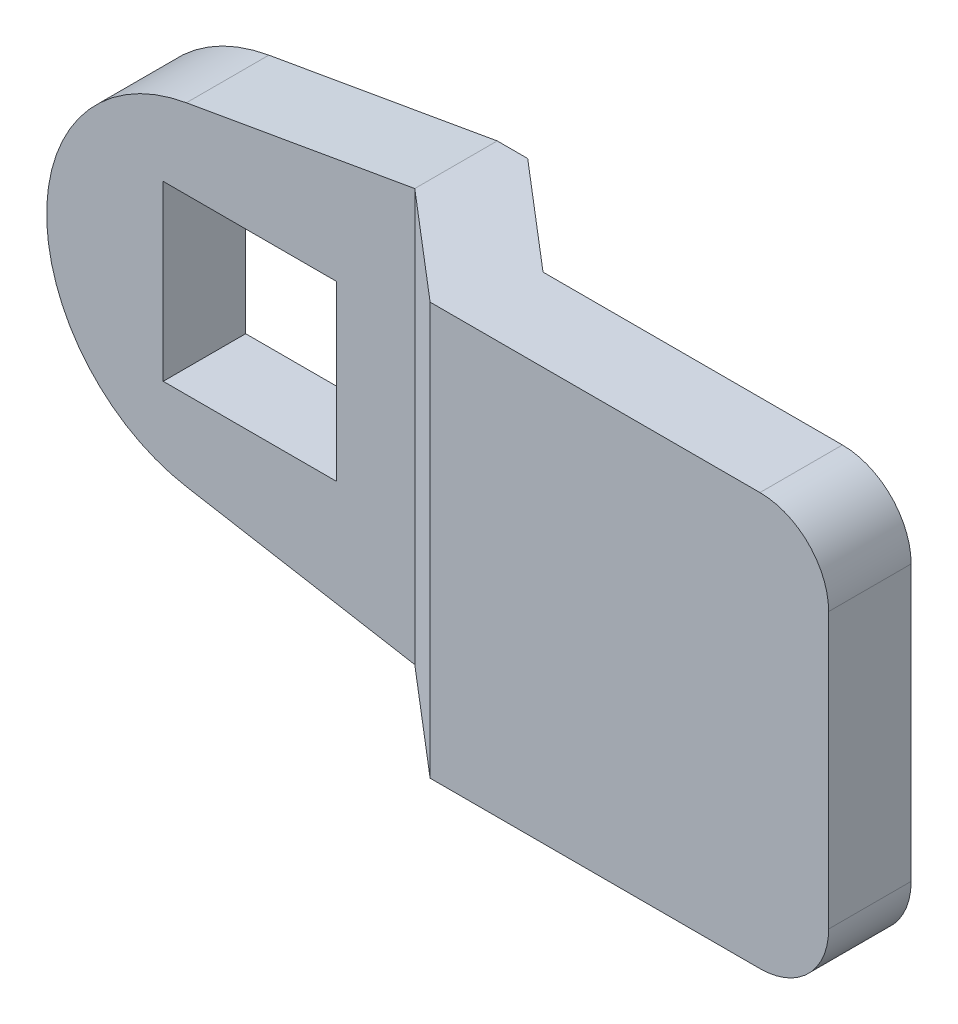
ISO-10303-21;
HEADER;
FILE_DESCRIPTION(('STEP AP214'),'2;1');
FILE_NAME('part.step','',(''),(''),'','','');
FILE_SCHEMA(('AUTOMOTIVE_DESIGN { 1 0 10303 214 1 1 1 1 }'));
ENDSEC;
DATA;
#1=APPLICATION_CONTEXT('core data for automotive mechanical design processes');
#2=APPLICATION_PROTOCOL_DEFINITION('international standard','automotive_design',2000,#1);
#3=PRODUCT_CONTEXT('',#1,'mechanical');
#4=PRODUCT('Part','Part','',(#3));
#5=PRODUCT_RELATED_PRODUCT_CATEGORY('part','',(#4));
#6=PRODUCT_DEFINITION_FORMATION('','',#4);
#7=PRODUCT_DEFINITION_CONTEXT('part definition',#1,'design');
#8=PRODUCT_DEFINITION('design','',#6,#7);
#9=PRODUCT_DEFINITION_SHAPE('','',#8);
#10=(LENGTH_UNIT() NAMED_UNIT(*) SI_UNIT(.MILLI.,.METRE.));
#11=(NAMED_UNIT(*) PLANE_ANGLE_UNIT() SI_UNIT($,.RADIAN.));
#12=(NAMED_UNIT(*) SI_UNIT($,.STERADIAN.) SOLID_ANGLE_UNIT());
#13=UNCERTAINTY_MEASURE_WITH_UNIT(LENGTH_MEASURE(1.E-05),#10,'distance_accuracy_value','');
#14=(GEOMETRIC_REPRESENTATION_CONTEXT(3) GLOBAL_UNCERTAINTY_ASSIGNED_CONTEXT((#13)) GLOBAL_UNIT_ASSIGNED_CONTEXT((#10,
#11,#12)) REPRESENTATION_CONTEXT('',''));
#15=CARTESIAN_POINT('',(0.,0.,0.));
#16=DIRECTION('',(0.,0.,1.));
#17=DIRECTION('',(1.,0.,0.));
#18=AXIS2_PLACEMENT_3D('',#15,#16,#17);
#19=CARTESIAN_POINT('',(5.3848,5.5245,-41.4980843476103));
#20=DIRECTION('',(0.,-1.,0.));
#21=DIRECTION('',(1.,0.,0.));
#22=AXIS2_PLACEMENT_3D('',#19,#20,#21);
#23=PLANE('',#22);
#24=DIRECTION('',(0.,0.,1.));
#25=VECTOR('',#24,1.);
#26=CARTESIAN_POINT('',(5.3848,5.5245,-41.4980843476103));
#27=LINE('',#26,#25);
#28=CARTESIAN_POINT('',(5.3848,5.5245,0.));
#29=VERTEX_POINT('',#28);
#30=CARTESIAN_POINT('',(5.3848,5.5245,3.80999999999907));
#31=VERTEX_POINT('',#30);
#32=EDGE_CURVE('E137',#29,#31,#27,.T.);
#33=ORIENTED_EDGE('',*,*,#32,.T.);
#34=DIRECTION('',(1.,0.,0.));
#35=VECTOR('',#34,1.);
#36=CARTESIAN_POINT('',(17.0078151947928,5.5245,3.81));
#37=LINE('',#36,#35);
#38=CARTESIAN_POINT('',(13.3858,5.52449999999999,3.80999999999861));
#39=VERTEX_POINT('',#38);
#40=EDGE_CURVE('E184',#39,#31,#37,.F.);
#41=ORIENTED_EDGE('',*,*,#40,.F.);
#42=DIRECTION('',(0.,0.,-1.));
#43=VECTOR('',#42,1.);
#44=CARTESIAN_POINT('',(13.3858,5.5245,-41.4980843476103));
#45=LINE('',#44,#43);
#46=CARTESIAN_POINT('',(13.3858,5.52449999999999,0.));
#47=VERTEX_POINT('',#46);
#48=EDGE_CURVE('E128',#39,#47,#45,.T.);
#49=ORIENTED_EDGE('',*,*,#48,.T.);
#50=DIRECTION('',(-1.,0.,0.));
#51=VECTOR('',#50,1.);
#52=CARTESIAN_POINT('',(0.,5.5245,0.));
#53=LINE('',#52,#51);
#54=EDGE_CURVE('E117',#29,#47,#53,.F.);
#55=ORIENTED_EDGE('',*,*,#54,.F.);
#56=EDGE_LOOP('',(#33,#41,#49,#55));
#57=FACE_BOUND('',#56,.T.);
#58=ADVANCED_FACE('F17',(#57),#23,.F.);
#59=CARTESIAN_POINT('',(5.3848,13.5255,-41.4980843476103));
#60=DIRECTION('',(-1.,0.,0.));
#61=DIRECTION('',(0.,0.,1.));
#62=AXIS2_PLACEMENT_3D('',#59,#60,#61);
#63=PLANE('',#62);
#64=DIRECTION('',(0.,0.,1.));
#65=VECTOR('',#64,1.);
#66=CARTESIAN_POINT('',(5.3848,13.5255,-41.4980843476103));
#67=LINE('',#66,#65);
#68=CARTESIAN_POINT('',(5.3848,13.5255,0.));
#69=VERTEX_POINT('',#68);
#70=CARTESIAN_POINT('',(5.3848,13.5255,3.80999999999954));
#71=VERTEX_POINT('',#70);
#72=EDGE_CURVE('E134',#69,#71,#67,.T.);
#73=ORIENTED_EDGE('',*,*,#72,.T.);
#74=DIRECTION('',(0.,1.,0.));
#75=VECTOR('',#74,1.);
#76=CARTESIAN_POINT('',(5.3848,19.05,3.81));
#77=LINE('',#76,#75);
#78=EDGE_CURVE('E178',#31,#71,#77,.T.);
#79=ORIENTED_EDGE('',*,*,#78,.F.);
#80=ORIENTED_EDGE('',*,*,#32,.F.);
#81=DIRECTION('',(0.,1.,0.));
#82=VECTOR('',#81,1.);
#83=CARTESIAN_POINT('',(5.3848,19.05,0.));
#84=LINE('',#83,#82);
#85=EDGE_CURVE('E120',#69,#29,#84,.F.);
#86=ORIENTED_EDGE('',*,*,#85,.F.);
#87=EDGE_LOOP('',(#73,#79,#80,#86));
#88=FACE_BOUND('',#87,.T.);
#89=ADVANCED_FACE('F226',(#88),#63,.F.);
#90=CARTESIAN_POINT('',(13.3858,13.5255,-41.4980843476103));
#91=DIRECTION('',(0.,1.,0.));
#92=DIRECTION('',(-1.,0.,0.));
#93=AXIS2_PLACEMENT_3D('',#90,#91,#92);
#94=PLANE('',#93);
#95=DIRECTION('',(0.,0.,-1.));
#96=VECTOR('',#95,1.);
#97=CARTESIAN_POINT('',(13.3858,13.5255,-41.4980843476103));
#98=LINE('',#97,#96);
#99=CARTESIAN_POINT('',(13.3858,13.5255,0.));
#100=VERTEX_POINT('',#99);
#101=CARTESIAN_POINT('',(13.3858,13.5255,3.80999999999861));
#102=VERTEX_POINT('',#101);
#103=EDGE_CURVE('E131',#100,#102,#98,.F.);
#104=ORIENTED_EDGE('',*,*,#103,.T.);
#105=DIRECTION('',(1.,0.,0.));
#106=VECTOR('',#105,1.);
#107=CARTESIAN_POINT('',(17.0078151947928,13.5255,3.81));
#108=LINE('',#107,#106);
#109=EDGE_CURVE('E171',#71,#102,#108,.T.);
#110=ORIENTED_EDGE('',*,*,#109,.F.);
#111=ORIENTED_EDGE('',*,*,#72,.F.);
#112=DIRECTION('',(-1.,0.,0.));
#113=VECTOR('',#112,1.);
#114=CARTESIAN_POINT('',(0.,13.5255,0.));
#115=LINE('',#114,#113);
#116=EDGE_CURVE('E206',#100,#69,#115,.T.);
#117=ORIENTED_EDGE('',*,*,#116,.F.);
#118=EDGE_LOOP('',(#104,#110,#111,#117));
#119=FACE_BOUND('',#118,.T.);
#120=ADVANCED_FACE('F240',(#119),#94,.F.);
#121=CARTESIAN_POINT('',(13.3858,5.5245,-41.4980843476103));
#122=DIRECTION('',(1.,0.,0.));
#123=DIRECTION('',(0.,0.,-1.));
#124=AXIS2_PLACEMENT_3D('',#121,#122,#123);
#125=PLANE('',#124);
#126=ORIENTED_EDGE('',*,*,#48,.F.);
#127=DIRECTION('',(0.,1.,0.));
#128=VECTOR('',#127,1.);
#129=CARTESIAN_POINT('',(13.3858,19.05,3.81));
#130=LINE('',#129,#128);
#131=EDGE_CURVE('E166',#102,#39,#130,.F.);
#132=ORIENTED_EDGE('',*,*,#131,.F.);
#133=ORIENTED_EDGE('',*,*,#103,.F.);
#134=DIRECTION('',(0.,1.,0.));
#135=VECTOR('',#134,1.);
#136=CARTESIAN_POINT('',(13.3858,19.05,0.));
#137=LINE('',#136,#135);
#138=EDGE_CURVE('E208',#47,#100,#137,.T.);
#139=ORIENTED_EDGE('',*,*,#138,.F.);
#140=EDGE_LOOP('',(#126,#132,#133,#139));
#141=FACE_BOUND('',#140,.T.);
#142=ADVANCED_FACE('F235',(#141),#125,.F.);
#143=CARTESIAN_POINT('',(7.7978,9.525,-41.4980843476103));
#144=DIRECTION('',(0.,0.,-1.));
#145=DIRECTION('',(-1.,0.,0.));
#146=AXIS2_PLACEMENT_3D('',#143,#144,#145);
#147=CYLINDRICAL_SURFACE('',#146,7.7978);
#148=CARTESIAN_POINT('',(7.79779999999999,9.525,3.80999999999815));
#149=DIRECTION('',(0.,0.,-1.));
#150=DIRECTION('',(-1.,0.,0.));
#151=AXIS2_PLACEMENT_3D('',#148,#149,#150);
#152=CIRCLE('',#151,7.7978);
#153=CARTESIAN_POINT('',(6.45577103250381,17.206447981364,3.80999999999908));
#154=VERTEX_POINT('',#153);
#155=CARTESIAN_POINT('',(6.45577103250381,1.84355201863599,3.80999999999815));
#156=VERTEX_POINT('',#155);
#157=EDGE_CURVE('E164',#154,#156,#152,.F.);
#158=ORIENTED_EDGE('',*,*,#157,.F.);
#159=DIRECTION('',(0.,0.,1.));
#160=VECTOR('',#159,1.);
#161=CARTESIAN_POINT('',(6.45577103250382,17.206447981364,-41.4980843476103));
#162=LINE('',#161,#160);
#163=CARTESIAN_POINT('',(6.45577103250381,17.206447981364,0.));
#164=VERTEX_POINT('',#163);
#165=EDGE_CURVE('E89',#164,#154,#162,.T.);
#166=ORIENTED_EDGE('',*,*,#165,.F.);
#167=CARTESIAN_POINT('',(7.79779999999999,9.525,0.));
#168=DIRECTION('',(0.,0.,-1.));
#169=DIRECTION('',(-1.,0.,0.));
#170=AXIS2_PLACEMENT_3D('',#167,#168,#169);
#171=CIRCLE('',#170,7.7978);
#172=CARTESIAN_POINT('',(6.45577103250381,1.84355201863599,0.));
#173=VERTEX_POINT('',#172);
#174=EDGE_CURVE('E20',#173,#164,#171,.T.);
#175=ORIENTED_EDGE('',*,*,#174,.F.);
#176=DIRECTION('',(0.,0.,1.));
#177=VECTOR('',#176,1.);
#178=CARTESIAN_POINT('',(6.45577103250382,1.84355201863599,-41.4980843476103));
#179=LINE('',#178,#177);
#180=EDGE_CURVE('E86',#156,#173,#179,.F.);
#181=ORIENTED_EDGE('',*,*,#180,.F.);
#182=EDGE_LOOP('',(#158,#166,#175,#181));
#183=FACE_BOUND('',#182,.T.);
#184=ADVANCED_FACE('F84',(#183),#147,.T.);
#185=CARTESIAN_POINT('',(0.,19.05,0.));
#186=DIRECTION('',(0.,0.,-1.));
#187=DIRECTION('',(-1.,0.,0.));
#188=AXIS2_PLACEMENT_3D('',#185,#186,#187);
#189=PLANE('',#188);
#190=DIRECTION('',(-1.,0.,0.));
#191=VECTOR('',#190,1.);
#192=CARTESIAN_POINT('',(0.,19.05,0.));
#193=LINE('',#192,#191);
#194=CARTESIAN_POINT('',(17.0078151947928,19.05,0.));
#195=VERTEX_POINT('',#194);
#196=CARTESIAN_POINT('',(18.415,19.05,0.));
#197=VERTEX_POINT('',#196);
#198=EDGE_CURVE('E93',#195,#197,#193,.F.);
#199=ORIENTED_EDGE('',*,*,#198,.T.);
#200=DIRECTION('',(0.,1.,0.));
#201=VECTOR('',#200,1.);
#202=CARTESIAN_POINT('',(18.415,19.05,0.));
#203=LINE('',#202,#201);
#204=CARTESIAN_POINT('',(18.415,0.,0.));
#205=VERTEX_POINT('',#204);
#206=EDGE_CURVE('E113',#205,#197,#203,.T.);
#207=ORIENTED_EDGE('',*,*,#206,.F.);
#208=DIRECTION('',(-1.,0.,0.));
#209=VECTOR('',#208,1.);
#210=CARTESIAN_POINT('',(0.,0.,0.));
#211=LINE('',#210,#209);
#212=CARTESIAN_POINT('',(17.0078034184614,6.72138468858766E-07,0.));
#213=VERTEX_POINT('',#212);
#214=EDGE_CURVE('E94',#205,#213,#211,.T.);
#215=ORIENTED_EDGE('',*,*,#214,.T.);
#216=DIRECTION('',(0.985078866008875,-0.172103537856344,0.));
#217=VECTOR('',#216,1.);
#218=CARTESIAN_POINT('',(17.0078151947928,0.,0.));
#219=LINE('',#218,#217);
#220=EDGE_CURVE('E97',#173,#213,#219,.T.);
#221=ORIENTED_EDGE('',*,*,#220,.F.);
#222=ORIENTED_EDGE('',*,*,#174,.T.);
#223=DIRECTION('',(-0.985078866008875,-0.172103537856344,0.));
#224=VECTOR('',#223,1.);
#225=CARTESIAN_POINT('',(17.0078151947928,19.05,0.));
#226=LINE('',#225,#224);
#227=EDGE_CURVE('E127',#195,#164,#226,.T.);
#228=ORIENTED_EDGE('',*,*,#227,.F.);
#229=EDGE_LOOP('',(#199,#207,#215,#221,#222,#228));
#230=FACE_BOUND('',#229,.T.);
#231=ORIENTED_EDGE('',*,*,#116,.T.);
#232=ORIENTED_EDGE('',*,*,#85,.T.);
#233=ORIENTED_EDGE('',*,*,#54,.T.);
#234=ORIENTED_EDGE('',*,*,#138,.T.);
#235=EDGE_LOOP('',(#231,#232,#233,#234));
#236=FACE_BOUND('',#235,.T.);
#237=ADVANCED_FACE('F99',(#230,#236),#189,.T.);
#238=CARTESIAN_POINT('',(17.0078151947928,19.05,-41.4980843476103));
#239=DIRECTION('',(-0.172103537856344,0.985078866008875,0.));
#240=DIRECTION('',(-0.985078866008875,-0.172103537856344,0.));
#241=AXIS2_PLACEMENT_3D('',#238,#239,#240);
#242=PLANE('',#241);
#243=DIRECTION('',(0.,0.,1.));
#244=VECTOR('',#243,1.);
#245=CARTESIAN_POINT('',(17.0078151947928,19.05,3.81));
#246=LINE('',#245,#244);
#247=CARTESIAN_POINT('',(17.0078151947923,19.05,3.80999999999961));
#248=VERTEX_POINT('',#247);
#249=EDGE_CURVE('E186',#195,#248,#246,.T.);
#250=ORIENTED_EDGE('',*,*,#249,.F.);
#251=ORIENTED_EDGE('',*,*,#227,.T.);
#252=ORIENTED_EDGE('',*,*,#165,.T.);
#253=DIRECTION('',(-0.985078866008874,-0.172103537856345,0.));
#254=VECTOR('',#253,1.);
#255=CARTESIAN_POINT('',(17.0078151947928,19.05,3.81));
#256=LINE('',#255,#254);
#257=EDGE_CURVE('E165',#248,#154,#256,.T.);
#258=ORIENTED_EDGE('',*,*,#257,.F.);
#259=EDGE_LOOP('',(#250,#251,#252,#258));
#260=FACE_BOUND('',#259,.T.);
#261=ADVANCED_FACE('F327',(#260),#242,.T.);
#262=CARTESIAN_POINT('',(17.0078151947928,19.05,3.81));
#263=DIRECTION('',(0.,0.,1.));
#264=DIRECTION('',(1.,0.,0.));
#265=AXIS2_PLACEMENT_3D('',#262,#263,#264);
#266=PLANE('',#265);
#267=DIRECTION('',(0.,1.,0.));
#268=VECTOR('',#267,1.);
#269=CARTESIAN_POINT('',(17.0078151947919,19.05,3.80999999999922));
#270=LINE('',#269,#268);
#271=CARTESIAN_POINT('',(17.0078092087648,1.37619009707863E-06,3.80999999999881));
#272=VERTEX_POINT('',#271);
#273=EDGE_CURVE('E154',#248,#272,#270,.F.);
#274=ORIENTED_EDGE('',*,*,#273,.F.);
#275=ORIENTED_EDGE('',*,*,#257,.T.);
#276=ORIENTED_EDGE('',*,*,#157,.T.);
#277=DIRECTION('',(0.985078866008875,-0.172103537856344,0.));
#278=VECTOR('',#277,1.);
#279=CARTESIAN_POINT('',(17.0078151947928,0.,3.80999999999815));
#280=LINE('',#279,#278);
#281=EDGE_CURVE('E111',#272,#156,#280,.F.);
#282=ORIENTED_EDGE('',*,*,#281,.F.);
#283=EDGE_LOOP('',(#274,#275,#276,#282));
#284=FACE_BOUND('',#283,.T.);
#285=ORIENTED_EDGE('',*,*,#109,.T.);
#286=ORIENTED_EDGE('',*,*,#131,.T.);
#287=ORIENTED_EDGE('',*,*,#40,.T.);
#288=ORIENTED_EDGE('',*,*,#78,.T.);
#289=EDGE_LOOP('',(#285,#286,#287,#288));
#290=FACE_BOUND('',#289,.T.);
#291=ADVANCED_FACE('F232',(#284,#290),#266,.T.);
#292=CARTESIAN_POINT('',(18.415,19.05,0.));
#293=DIRECTION('',(0.6500105063926,0.,-0.759925221044305));
#294=DIRECTION('',(-0.759925221044305,0.,-0.6500105063926));
#295=AXIS2_PLACEMENT_3D('',#292,#293,#294);
#296=PLANE('',#295);
#297=DIRECTION('',(-0.759925221044303,0.,-0.650010506392602));
#298=VECTOR('',#297,1.);
#299=CARTESIAN_POINT('',(23.3146848052069,19.05,4.191));
#300=LINE('',#299,#298);
#301=CARTESIAN_POINT('',(23.3146848052069,19.05,4.191));
#302=VERTEX_POINT('',#301);
#303=EDGE_CURVE('E189',#302,#197,#300,.T.);
#304=ORIENTED_EDGE('',*,*,#303,.F.);
#305=DIRECTION('',(0.,1.,0.));
#306=VECTOR('',#305,1.);
#307=CARTESIAN_POINT('',(23.3146848052069,19.05,4.191));
#308=LINE('',#307,#306);
#309=CARTESIAN_POINT('',(23.3146848052069,0.,4.191));
#310=VERTEX_POINT('',#309);
#311=EDGE_CURVE('E107',#310,#302,#308,.T.);
#312=ORIENTED_EDGE('',*,*,#311,.F.);
#313=DIRECTION('',(-0.759925221044303,0.,-0.650010506392602));
#314=VECTOR('',#313,1.);
#315=CARTESIAN_POINT('',(23.3146848052069,0.,4.191));
#316=LINE('',#315,#314);
#317=EDGE_CURVE('E157',#310,#205,#316,.T.);
#318=ORIENTED_EDGE('',*,*,#317,.T.);
#319=ORIENTED_EDGE('',*,*,#206,.T.);
#320=EDGE_LOOP('',(#304,#312,#318,#319));
#321=FACE_BOUND('',#320,.T.);
#322=ADVANCED_FACE('F256',(#321),#296,.T.);
#323=CARTESIAN_POINT('',(17.0078151947928,0.,-41.4980843476103));
#324=DIRECTION('',(-0.172103537856344,-0.985078866008875,0.));
#325=DIRECTION('',(0.985078866008875,-0.172103537856344,0.));
#326=AXIS2_PLACEMENT_3D('',#323,#324,#325);
#327=PLANE('',#326);
#328=ORIENTED_EDGE('',*,*,#180,.T.);
#329=ORIENTED_EDGE('',*,*,#220,.T.);
#330=DIRECTION('',(0.,0.,1.));
#331=VECTOR('',#330,1.);
#332=CARTESIAN_POINT('',(17.0078033010318,0.,3.81));
#333=LINE('',#332,#331);
#334=EDGE_CURVE('E151',#213,#272,#333,.T.);
#335=ORIENTED_EDGE('',*,*,#334,.T.);
#336=ORIENTED_EDGE('',*,*,#281,.T.);
#337=EDGE_LOOP('',(#328,#329,#335,#336));
#338=FACE_BOUND('',#337,.T.);
#339=ADVANCED_FACE('F109',(#338),#327,.T.);
#340=CARTESIAN_POINT('',(23.3146848052069,19.05,4.191));
#341=DIRECTION('',(0.,0.,-1.));
#342=DIRECTION('',(-1.,0.,0.));
#343=AXIS2_PLACEMENT_3D('',#340,#341,#342);
#344=PLANE('',#343);
#345=DIRECTION('',(1.,0.,0.));
#346=VECTOR('',#345,1.);
#347=CARTESIAN_POINT('',(0.,0.,4.191));
#348=LINE('',#347,#346);
#349=CARTESIAN_POINT('',(37.1475003275884,0.,4.191));
#350=VERTEX_POINT('',#349);
#351=EDGE_CURVE('E150',#350,#310,#348,.F.);
#352=ORIENTED_EDGE('',*,*,#351,.T.);
#353=ORIENTED_EDGE('',*,*,#311,.T.);
#354=DIRECTION('',(1.,0.,0.));
#355=VECTOR('',#354,1.);
#356=CARTESIAN_POINT('',(0.,19.05,4.191));
#357=LINE('',#356,#355);
#358=CARTESIAN_POINT('',(37.1475006551768,19.05,4.191));
#359=VERTEX_POINT('',#358);
#360=EDGE_CURVE('E195',#359,#302,#357,.F.);
#361=ORIENTED_EDGE('',*,*,#360,.F.);
#362=CARTESIAN_POINT('',(37.1475006551768,15.875,4.191));
#363=DIRECTION('',(0.,0.,-1.));
#364=DIRECTION('',(-1.,0.,0.));
#365=AXIS2_PLACEMENT_3D('',#362,#363,#364);
#366=CIRCLE('',#365,3.175);
#367=CARTESIAN_POINT('',(40.3225,15.8770396991039,4.191));
#368=VERTEX_POINT('',#367);
#369=EDGE_CURVE('E161',#368,#359,#366,.F.);
#370=ORIENTED_EDGE('',*,*,#369,.F.);
#371=DIRECTION('',(0.,1.,0.));
#372=VECTOR('',#371,1.);
#373=CARTESIAN_POINT('',(40.3225,19.05,4.191));
#374=LINE('',#373,#372);
#375=CARTESIAN_POINT('',(40.3225003275884,3.175,4.191));
#376=VERTEX_POINT('',#375);
#377=EDGE_CURVE('E260',#376,#368,#374,.T.);
#378=ORIENTED_EDGE('',*,*,#377,.F.);
#379=CARTESIAN_POINT('',(37.1475006551768,3.175,4.191));
#380=DIRECTION('',(0.,0.,-1.));
#381=DIRECTION('',(-1.,0.,0.));
#382=AXIS2_PLACEMENT_3D('',#379,#380,#381);
#383=CIRCLE('',#382,3.175);
#384=EDGE_CURVE('E145',#350,#376,#383,.F.);
#385=ORIENTED_EDGE('',*,*,#384,.F.);
#386=EDGE_LOOP('',(#352,#353,#361,#370,#378,#385));
#387=FACE_BOUND('',#386,.T.);
#388=ADVANCED_FACE('F263',(#387),#344,.T.);
#389=CARTESIAN_POINT('',(40.3225,19.05,8.00100000000023));
#390=DIRECTION('',(1.,0.,0.));
#391=DIRECTION('',(0.,0.,-1.));
#392=AXIS2_PLACEMENT_3D('',#389,#390,#391);
#393=PLANE('',#392);
#394=DIRECTION('',(0.,0.,-1.));
#395=VECTOR('',#394,1.);
#396=CARTESIAN_POINT('',(40.3225,15.8770396991039,-37.307084930693));
#397=LINE('',#396,#395);
#398=CARTESIAN_POINT('',(40.3225001637942,15.8770396991039,8.0009999999993));
#399=VERTEX_POINT('',#398);
#400=EDGE_CURVE('E163',#399,#368,#397,.T.);
#401=ORIENTED_EDGE('',*,*,#400,.F.);
#402=DIRECTION('',(0.,1.,0.));
#403=VECTOR('',#402,1.);
#404=CARTESIAN_POINT('',(40.3225006551768,19.05,8.00100000000023));
#405=LINE('',#404,#403);
#406=CARTESIAN_POINT('',(40.3225006551768,3.175,8.0009999999993));
#407=VERTEX_POINT('',#406);
#408=EDGE_CURVE('E144',#407,#399,#405,.T.);
#409=ORIENTED_EDGE('',*,*,#408,.F.);
#410=DIRECTION('',(0.,0.,-1.));
#411=VECTOR('',#410,1.);
#412=CARTESIAN_POINT('',(40.3225006551768,3.175,-37.307084930693));
#413=LINE('',#412,#411);
#414=EDGE_CURVE('E264',#376,#407,#413,.F.);
#415=ORIENTED_EDGE('',*,*,#414,.F.);
#416=ORIENTED_EDGE('',*,*,#377,.T.);
#417=EDGE_LOOP('',(#401,#409,#415,#416));
#418=FACE_BOUND('',#417,.T.);
#419=ADVANCED_FACE('F331',(#418),#393,.T.);
#420=CARTESIAN_POINT('',(37.1475006551768,15.875,-37.307084930693));
#421=DIRECTION('',(0.,0.,-1.));
#422=DIRECTION('',(-1.,0.,0.));
#423=AXIS2_PLACEMENT_3D('',#420,#421,#422);
#424=CYLINDRICAL_SURFACE('',#423,3.175);
#425=ORIENTED_EDGE('',*,*,#400,.T.);
#426=ORIENTED_EDGE('',*,*,#369,.T.);
#427=DIRECTION('',(0.,0.,1.));
#428=VECTOR('',#427,1.);
#429=CARTESIAN_POINT('',(37.1475006551768,19.05,3.81));
#430=LINE('',#429,#428);
#431=CARTESIAN_POINT('',(37.1475006551768,19.05,8.0009999999993));
#432=VERTEX_POINT('',#431);
#433=EDGE_CURVE('E162',#432,#359,#430,.F.);
#434=ORIENTED_EDGE('',*,*,#433,.F.);
#435=CARTESIAN_POINT('',(37.1475006551768,15.875,8.00099999999838));
#436=DIRECTION('',(0.,0.,-1.));
#437=DIRECTION('',(-1.,0.,0.));
#438=AXIS2_PLACEMENT_3D('',#435,#436,#437);
#439=CIRCLE('',#438,3.175);
#440=EDGE_CURVE('E140',#399,#432,#439,.F.);
#441=ORIENTED_EDGE('',*,*,#440,.F.);
#442=EDGE_LOOP('',(#425,#426,#434,#441));
#443=FACE_BOUND('',#442,.T.);
#444=ADVANCED_FACE('F291',(#443),#424,.T.);
#445=CARTESIAN_POINT('',(0.,19.05,3.81));
#446=DIRECTION('',(0.,1.,0.));
#447=DIRECTION('',(0.,0.,1.));
#448=AXIS2_PLACEMENT_3D('',#445,#446,#447);
#449=PLANE('',#448);
#450=DIRECTION('',(0.759925221044305,0.,0.6500105063926));
#451=VECTOR('',#450,1.);
#452=CARTESIAN_POINT('',(17.0078151947928,19.05,3.81));
#453=LINE('',#452,#451);
#454=CARTESIAN_POINT('',(21.9075,19.05,8.00100000000023));
#455=VERTEX_POINT('',#454);
#456=EDGE_CURVE('E158',#455,#248,#453,.F.);
#457=ORIENTED_EDGE('',*,*,#456,.F.);
#458=DIRECTION('',(1.,0.,0.));
#459=VECTOR('',#458,1.);
#460=CARTESIAN_POINT('',(21.9075,19.05,8.00100000000023));
#461=LINE('',#460,#459);
#462=EDGE_CURVE('E143',#432,#455,#461,.F.);
#463=ORIENTED_EDGE('',*,*,#462,.F.);
#464=ORIENTED_EDGE('',*,*,#433,.T.);
#465=ORIENTED_EDGE('',*,*,#360,.T.);
#466=ORIENTED_EDGE('',*,*,#303,.T.);
#467=ORIENTED_EDGE('',*,*,#198,.F.);
#468=ORIENTED_EDGE('',*,*,#249,.T.);
#469=EDGE_LOOP('',(#457,#463,#464,#465,#466,#467,#468));
#470=FACE_BOUND('',#469,.T.);
#471=ADVANCED_FACE('F283',(#470),#449,.T.);
#472=CARTESIAN_POINT('',(17.0078151947928,19.05,3.81));
#473=DIRECTION('',(-0.6500105063926,0.,0.759925221044305));
#474=DIRECTION('',(0.759925221044305,0.,0.6500105063926));
#475=AXIS2_PLACEMENT_3D('',#472,#473,#474);
#476=PLANE('',#475);
#477=ORIENTED_EDGE('',*,*,#456,.T.);
#478=ORIENTED_EDGE('',*,*,#273,.T.);
#479=DIRECTION('',(0.759925221044305,0.,0.6500105063926));
#480=VECTOR('',#479,1.);
#481=CARTESIAN_POINT('',(7.18603421969617,0.,-4.59116981053265));
#482=LINE('',#481,#480);
#483=CARTESIAN_POINT('',(21.9075,0.,8.00100000000023));
#484=VERTEX_POINT('',#483);
#485=EDGE_CURVE('E148',#272,#484,#482,.T.);
#486=ORIENTED_EDGE('',*,*,#485,.T.);
#487=DIRECTION('',(0.,1.,0.));
#488=VECTOR('',#487,1.);
#489=CARTESIAN_POINT('',(21.9075,19.05,8.00100000000023));
#490=LINE('',#489,#488);
#491=EDGE_CURVE('E306',#455,#484,#490,.F.);
#492=ORIENTED_EDGE('',*,*,#491,.F.);
#493=EDGE_LOOP('',(#477,#478,#486,#492));
#494=FACE_BOUND('',#493,.T.);
#495=ADVANCED_FACE('F323',(#494),#476,.T.);
#496=CARTESIAN_POINT('',(0.,0.,3.81));
#497=DIRECTION('',(0.,1.,0.));
#498=DIRECTION('',(0.,0.,1.));
#499=AXIS2_PLACEMENT_3D('',#496,#497,#498);
#500=PLANE('',#499);
#501=DIRECTION('',(0.,0.,-1.));
#502=VECTOR('',#501,1.);
#503=CARTESIAN_POINT('',(37.1475,0.,-37.307084930693));
#504=LINE('',#503,#502);
#505=CARTESIAN_POINT('',(37.1475003275884,0.,8.0009999999993));
#506=VERTEX_POINT('',#505);
#507=EDGE_CURVE('E35',#506,#350,#504,.T.);
#508=ORIENTED_EDGE('',*,*,#507,.F.);
#509=DIRECTION('',(1.,0.,0.));
#510=VECTOR('',#509,1.);
#511=CARTESIAN_POINT('',(21.9075,0.,8.00100000000023));
#512=LINE('',#511,#510);
#513=EDGE_CURVE('E26',#484,#506,#512,.T.);
#514=ORIENTED_EDGE('',*,*,#513,.F.);
#515=ORIENTED_EDGE('',*,*,#485,.F.);
#516=ORIENTED_EDGE('',*,*,#334,.F.);
#517=ORIENTED_EDGE('',*,*,#214,.F.);
#518=ORIENTED_EDGE('',*,*,#317,.F.);
#519=ORIENTED_EDGE('',*,*,#351,.F.);
#520=EDGE_LOOP('',(#508,#514,#515,#516,#517,#518,#519));
#521=FACE_BOUND('',#520,.T.);
#522=ADVANCED_FACE('F266',(#521),#500,.F.);
#523=CARTESIAN_POINT('',(37.1475006551768,3.175,-37.307084930693));
#524=DIRECTION('',(0.,0.,-1.));
#525=DIRECTION('',(-1.,0.,0.));
#526=AXIS2_PLACEMENT_3D('',#523,#524,#525);
#527=CYLINDRICAL_SURFACE('',#526,3.175);
#528=ORIENTED_EDGE('',*,*,#507,.T.);
#529=ORIENTED_EDGE('',*,*,#384,.T.);
#530=ORIENTED_EDGE('',*,*,#414,.T.);
#531=CARTESIAN_POINT('',(37.1475006551768,3.175,8.00099999999838));
#532=DIRECTION('',(0.,0.,-1.));
#533=DIRECTION('',(-1.,0.,0.));
#534=AXIS2_PLACEMENT_3D('',#531,#532,#533);
#535=CIRCLE('',#534,3.175);
#536=EDGE_CURVE('E11',#506,#407,#535,.F.);
#537=ORIENTED_EDGE('',*,*,#536,.F.);
#538=EDGE_LOOP('',(#528,#529,#530,#537));
#539=FACE_BOUND('',#538,.T.);
#540=ADVANCED_FACE('F333',(#539),#527,.T.);
#541=CARTESIAN_POINT('',(21.9075,19.05,8.00100000000023));
#542=DIRECTION('',(0.,0.,1.));
#543=DIRECTION('',(1.,0.,0.));
#544=AXIS2_PLACEMENT_3D('',#541,#542,#543);
#545=PLANE('',#544);
#546=ORIENTED_EDGE('',*,*,#513,.T.);
#547=ORIENTED_EDGE('',*,*,#536,.T.);
#548=ORIENTED_EDGE('',*,*,#408,.T.);
#549=ORIENTED_EDGE('',*,*,#440,.T.);
#550=ORIENTED_EDGE('',*,*,#462,.T.);
#551=ORIENTED_EDGE('',*,*,#491,.T.);
#552=EDGE_LOOP('',(#546,#547,#548,#549,#550,#551));
#553=FACE_BOUND('',#552,.T.);
#554=ADVANCED_FACE('F319',(#553),#545,.T.);
#555=CLOSED_SHELL('',(#58,#89,#120,#142,#184,#237,#261,#291,#322,#339,#388,#419,#444,#471,#495,
#522,#540,#554));
#556=MANIFOLD_SOLID_BREP('B1',#555);
#557=ADVANCED_BREP_SHAPE_REPRESENTATION('',(#18,#556),#14);
#558=SHAPE_DEFINITION_REPRESENTATION(#9,#557);
ENDSEC;
END-ISO-10303-21;
